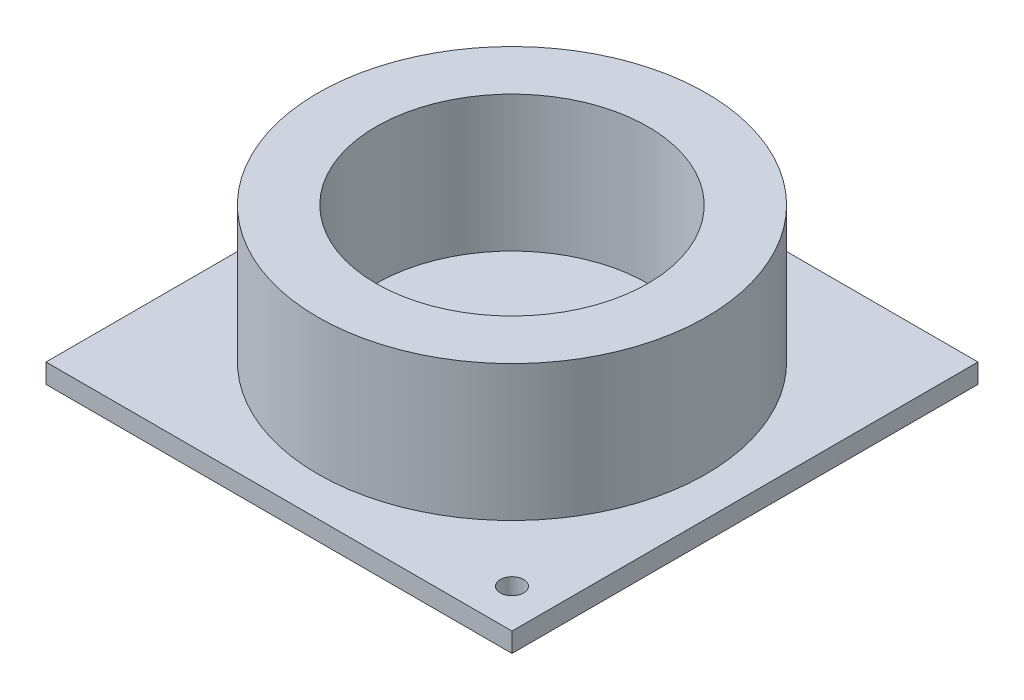
ISO-10303-21;
HEADER;
FILE_DESCRIPTION(('STEP AP214'),'2;1');
FILE_NAME('part.step','',(''),(''),'','','');
FILE_SCHEMA(('AUTOMOTIVE_DESIGN { 1 0 10303 214 1 1 1 1 }'));
ENDSEC;
DATA;
#1=APPLICATION_CONTEXT('core data for automotive mechanical design processes');
#2=APPLICATION_PROTOCOL_DEFINITION('international standard','automotive_design',2000,#1);
#3=PRODUCT_CONTEXT('',#1,'mechanical');
#4=PRODUCT('Part','Part','',(#3));
#5=PRODUCT_RELATED_PRODUCT_CATEGORY('part','',(#4));
#6=PRODUCT_DEFINITION_FORMATION('','',#4);
#7=PRODUCT_DEFINITION_CONTEXT('part definition',#1,'design');
#8=PRODUCT_DEFINITION('design','',#6,#7);
#9=PRODUCT_DEFINITION_SHAPE('','',#8);
#10=(LENGTH_UNIT() NAMED_UNIT(*) SI_UNIT(.MILLI.,.METRE.));
#11=(NAMED_UNIT(*) PLANE_ANGLE_UNIT() SI_UNIT($,.RADIAN.));
#12=(NAMED_UNIT(*) SI_UNIT($,.STERADIAN.) SOLID_ANGLE_UNIT());
#13=UNCERTAINTY_MEASURE_WITH_UNIT(LENGTH_MEASURE(1.E-05),#10,'distance_accuracy_value','');
#14=(GEOMETRIC_REPRESENTATION_CONTEXT(3) GLOBAL_UNCERTAINTY_ASSIGNED_CONTEXT((#13)) GLOBAL_UNIT_ASSIGNED_CONTEXT((#10,
#11,#12)) REPRESENTATION_CONTEXT('',''));
#15=CARTESIAN_POINT('',(0.,0.,0.));
#16=DIRECTION('',(0.,0.,1.));
#17=DIRECTION('',(1.,0.,0.));
#18=AXIS2_PLACEMENT_3D('',#15,#16,#17);
#19=CARTESIAN_POINT('',(0.,40.,0.));
#20=DIRECTION('',(0.,1.,0.));
#21=DIRECTION('',(0.,0.,1.));
#22=AXIS2_PLACEMENT_3D('',#19,#20,#21);
#23=PLANE('',#22);
#24=CARTESIAN_POINT('',(0.,40.,0.));
#25=DIRECTION('',(0.,1.,0.));
#26=DIRECTION('',(0.,0.,1.));
#27=AXIS2_PLACEMENT_3D('',#24,#25,#26);
#28=CIRCLE('',#27,50.);
#29=CARTESIAN_POINT('',(0.,40.,50.));
#30=VERTEX_POINT('',#29);
#31=EDGE_CURVE('E49',#30,#30,#28,.T.);
#32=ORIENTED_EDGE('',*,*,#31,.T.);
#33=EDGE_LOOP('',(#32));
#34=FACE_BOUND('',#33,.T.);
#35=CARTESIAN_POINT('',(0.,40.,0.));
#36=DIRECTION('',(0.,1.,0.));
#37=DIRECTION('',(0.,0.,1.));
#38=AXIS2_PLACEMENT_3D('',#35,#36,#37);
#39=CIRCLE('',#38,35.);
#40=CARTESIAN_POINT('',(0.,40.,35.));
#41=VERTEX_POINT('',#40);
#42=EDGE_CURVE('E133',#41,#41,#39,.T.);
#43=ORIENTED_EDGE('',*,*,#42,.F.);
#44=EDGE_LOOP('',(#43));
#45=FACE_BOUND('',#44,.T.);
#46=ADVANCED_FACE('F39',(#34,#45),#23,.T.);
#47=CARTESIAN_POINT('',(0.,40.,0.));
#48=DIRECTION('',(0.,-1.,0.));
#49=DIRECTION('',(0.,0.,-1.));
#50=AXIS2_PLACEMENT_3D('',#47,#48,#49);
#51=CYLINDRICAL_SURFACE('',#50,50.);
#52=CARTESIAN_POINT('',(0.,5.,0.));
#53=DIRECTION('',(0.,1.,0.));
#54=DIRECTION('',(0.,0.,1.));
#55=AXIS2_PLACEMENT_3D('',#52,#53,#54);
#56=CIRCLE('',#55,50.);
#57=CARTESIAN_POINT('',(0.,5.,50.));
#58=VERTEX_POINT('',#57);
#59=EDGE_CURVE('E129',#58,#58,#56,.T.);
#60=ORIENTED_EDGE('',*,*,#59,.T.);
#61=EDGE_LOOP('',(#60));
#62=FACE_BOUND('',#61,.T.);
#63=ORIENTED_EDGE('',*,*,#31,.F.);
#64=EDGE_LOOP('',(#63));
#65=FACE_BOUND('',#64,.T.);
#66=ADVANCED_FACE('F41',(#62,#65),#51,.T.);
#67=CARTESIAN_POINT('',(0.,40.,0.));
#68=DIRECTION('',(0.,-1.,0.));
#69=DIRECTION('',(0.,0.,-1.));
#70=AXIS2_PLACEMENT_3D('',#67,#68,#69);
#71=CYLINDRICAL_SURFACE('',#70,35.);
#72=CARTESIAN_POINT('',(0.,5.,0.));
#73=DIRECTION('',(0.,1.,0.));
#74=DIRECTION('',(0.,0.,1.));
#75=AXIS2_PLACEMENT_3D('',#72,#73,#74);
#76=CIRCLE('',#75,35.);
#77=CARTESIAN_POINT('',(0.,5.,35.));
#78=VERTEX_POINT('',#77);
#79=EDGE_CURVE('E11',#78,#78,#76,.T.);
#80=ORIENTED_EDGE('',*,*,#79,.F.);
#81=EDGE_LOOP('',(#80));
#82=FACE_BOUND('',#81,.T.);
#83=ORIENTED_EDGE('',*,*,#42,.T.);
#84=EDGE_LOOP('',(#83));
#85=FACE_BOUND('',#84,.T.);
#86=ADVANCED_FACE('F143',(#82,#85),#71,.F.);
#87=CARTESIAN_POINT('',(0.,5.,0.));
#88=DIRECTION('',(0.,1.,0.));
#89=DIRECTION('',(0.,0.,1.));
#90=AXIS2_PLACEMENT_3D('',#87,#88,#89);
#91=PLANE('',#90);
#92=ORIENTED_EDGE('',*,*,#79,.T.);
#93=EDGE_LOOP('',(#92));
#94=FACE_BOUND('',#93,.T.);
#95=ADVANCED_FACE('F149',(#94),#91,.T.);
#96=CARTESIAN_POINT('',(60.,5.,-60.));
#97=DIRECTION('',(-1.,0.,0.));
#98=DIRECTION('',(0.,0.,1.));
#99=AXIS2_PLACEMENT_3D('',#96,#97,#98);
#100=PLANE('',#99);
#101=DIRECTION('',(0.,0.,-1.));
#102=VECTOR('',#101,1.);
#103=CARTESIAN_POINT('',(60.,0.,-60.));
#104=LINE('',#103,#102);
#105=CARTESIAN_POINT('',(60.,0.,60.));
#106=VERTEX_POINT('',#105);
#107=CARTESIAN_POINT('',(60.,0.,-60.));
#108=VERTEX_POINT('',#107);
#109=EDGE_CURVE('E112',#106,#108,#104,.T.);
#110=ORIENTED_EDGE('',*,*,#109,.T.);
#111=DIRECTION('',(0.,-1.,0.));
#112=VECTOR('',#111,1.);
#113=CARTESIAN_POINT('',(60.,5.,-60.));
#114=LINE('',#113,#112);
#115=CARTESIAN_POINT('',(60.,5.,-60.));
#116=VERTEX_POINT('',#115);
#117=EDGE_CURVE('E101',#116,#108,#114,.T.);
#118=ORIENTED_EDGE('',*,*,#117,.F.);
#119=DIRECTION('',(0.,0.,-1.));
#120=VECTOR('',#119,1.);
#121=CARTESIAN_POINT('',(60.,5.,-60.));
#122=LINE('',#121,#120);
#123=CARTESIAN_POINT('',(60.,5.,60.));
#124=VERTEX_POINT('',#123);
#125=EDGE_CURVE('E93',#124,#116,#122,.T.);
#126=ORIENTED_EDGE('',*,*,#125,.F.);
#127=DIRECTION('',(0.,-1.,0.));
#128=VECTOR('',#127,1.);
#129=CARTESIAN_POINT('',(60.,5.,60.));
#130=LINE('',#129,#128);
#131=EDGE_CURVE('E108',#124,#106,#130,.T.);
#132=ORIENTED_EDGE('',*,*,#131,.T.);
#133=EDGE_LOOP('',(#110,#118,#126,#132));
#134=FACE_BOUND('',#133,.T.);
#135=ADVANCED_FACE('F171',(#134),#100,.F.);
#136=CARTESIAN_POINT('',(-60.,5.,-60.));
#137=DIRECTION('',(0.,0.,1.));
#138=DIRECTION('',(1.,0.,0.));
#139=AXIS2_PLACEMENT_3D('',#136,#137,#138);
#140=PLANE('',#139);
#141=DIRECTION('',(-1.,0.,0.));
#142=VECTOR('',#141,1.);
#143=CARTESIAN_POINT('',(-60.,0.,-60.));
#144=LINE('',#143,#142);
#145=CARTESIAN_POINT('',(-60.,0.,-60.));
#146=VERTEX_POINT('',#145);
#147=EDGE_CURVE('E99',#108,#146,#144,.T.);
#148=ORIENTED_EDGE('',*,*,#147,.T.);
#149=DIRECTION('',(0.,-1.,0.));
#150=VECTOR('',#149,1.);
#151=CARTESIAN_POINT('',(-60.,5.,-60.));
#152=LINE('',#151,#150);
#153=CARTESIAN_POINT('',(-60.,5.,-60.));
#154=VERTEX_POINT('',#153);
#155=EDGE_CURVE('E97',#154,#146,#152,.T.);
#156=ORIENTED_EDGE('',*,*,#155,.F.);
#157=DIRECTION('',(-1.,0.,0.));
#158=VECTOR('',#157,1.);
#159=CARTESIAN_POINT('',(-60.,5.,-60.));
#160=LINE('',#159,#158);
#161=EDGE_CURVE('E88',#116,#154,#160,.T.);
#162=ORIENTED_EDGE('',*,*,#161,.F.);
#163=ORIENTED_EDGE('',*,*,#117,.T.);
#164=EDGE_LOOP('',(#148,#156,#162,#163));
#165=FACE_BOUND('',#164,.T.);
#166=ADVANCED_FACE('F98',(#165),#140,.F.);
#167=CARTESIAN_POINT('',(-60.,5.,-60.));
#168=DIRECTION('',(1.,0.,0.));
#169=DIRECTION('',(0.,0.,-1.));
#170=AXIS2_PLACEMENT_3D('',#167,#168,#169);
#171=PLANE('',#170);
#172=DIRECTION('',(0.,0.,1.));
#173=VECTOR('',#172,1.);
#174=CARTESIAN_POINT('',(-60.,0.,-60.));
#175=LINE('',#174,#173);
#176=CARTESIAN_POINT('',(-60.,0.,60.));
#177=VERTEX_POINT('',#176);
#178=EDGE_CURVE('E74',#146,#177,#175,.T.);
#179=ORIENTED_EDGE('',*,*,#178,.T.);
#180=DIRECTION('',(0.,-1.,0.));
#181=VECTOR('',#180,1.);
#182=CARTESIAN_POINT('',(-60.,5.,60.));
#183=LINE('',#182,#181);
#184=CARTESIAN_POINT('',(-60.,5.,60.));
#185=VERTEX_POINT('',#184);
#186=EDGE_CURVE('E102',#185,#177,#183,.T.);
#187=ORIENTED_EDGE('',*,*,#186,.F.);
#188=DIRECTION('',(0.,0.,1.));
#189=VECTOR('',#188,1.);
#190=CARTESIAN_POINT('',(-60.,5.,-60.));
#191=LINE('',#190,#189);
#192=EDGE_CURVE('E91',#154,#185,#191,.T.);
#193=ORIENTED_EDGE('',*,*,#192,.F.);
#194=ORIENTED_EDGE('',*,*,#155,.T.);
#195=EDGE_LOOP('',(#179,#187,#193,#194));
#196=FACE_BOUND('',#195,.T.);
#197=ADVANCED_FACE('F104',(#196),#171,.F.);
#198=CARTESIAN_POINT('',(-60.,5.,60.));
#199=DIRECTION('',(0.,0.,-1.));
#200=DIRECTION('',(-1.,0.,0.));
#201=AXIS2_PLACEMENT_3D('',#198,#199,#200);
#202=PLANE('',#201);
#203=DIRECTION('',(1.,0.,0.));
#204=VECTOR('',#203,1.);
#205=CARTESIAN_POINT('',(-60.,0.,60.));
#206=LINE('',#205,#204);
#207=EDGE_CURVE('E80',#177,#106,#206,.T.);
#208=ORIENTED_EDGE('',*,*,#207,.T.);
#209=ORIENTED_EDGE('',*,*,#131,.F.);
#210=DIRECTION('',(1.,0.,0.));
#211=VECTOR('',#210,1.);
#212=CARTESIAN_POINT('',(-60.,5.,60.));
#213=LINE('',#212,#211);
#214=EDGE_CURVE('E57',#185,#124,#213,.T.);
#215=ORIENTED_EDGE('',*,*,#214,.F.);
#216=ORIENTED_EDGE('',*,*,#186,.T.);
#217=EDGE_LOOP('',(#208,#209,#215,#216));
#218=FACE_BOUND('',#217,.T.);
#219=ADVANCED_FACE('F157',(#218),#202,.F.);
#220=CARTESIAN_POINT('',(-50.,5.,-50.));
#221=DIRECTION('',(0.,1.,0.));
#222=DIRECTION('',(0.,0.,1.));
#223=AXIS2_PLACEMENT_3D('',#220,#221,#222);
#224=CIRCLE('',#223,3.);
#225=CARTESIAN_POINT('',(-50.,5.,-47.));
#226=VERTEX_POINT('',#225);
#227=EDGE_CURVE('E232',#226,#226,#224,.T.);
#228=ORIENTED_EDGE('',*,*,#227,.F.);
#229=EDGE_LOOP('',(#228));
#230=FACE_BOUND('',#229,.T.);
#231=CARTESIAN_POINT('',(50.,5.,50.));
#232=DIRECTION('',(0.,1.,0.));
#233=DIRECTION('',(0.,0.,1.));
#234=AXIS2_PLACEMENT_3D('',#231,#232,#233);
#235=CIRCLE('',#234,3.);
#236=CARTESIAN_POINT('',(50.,5.,53.));
#237=VERTEX_POINT('',#236);
#238=EDGE_CURVE('E240',#237,#237,#235,.T.);
#239=ORIENTED_EDGE('',*,*,#238,.F.);
#240=EDGE_LOOP('',(#239));
#241=FACE_BOUND('',#240,.T.);
#242=ORIENTED_EDGE('',*,*,#59,.F.);
#243=EDGE_LOOP('',(#242));
#244=FACE_BOUND('',#243,.T.);
#245=ORIENTED_EDGE('',*,*,#125,.T.);
#246=ORIENTED_EDGE('',*,*,#161,.T.);
#247=ORIENTED_EDGE('',*,*,#192,.T.);
#248=ORIENTED_EDGE('',*,*,#214,.T.);
#249=EDGE_LOOP('',(#245,#246,#247,#248));
#250=FACE_BOUND('',#249,.T.);
#251=ADVANCED_FACE('F89',(#230,#241,#244,#250),#91,.T.);
#252=CARTESIAN_POINT('',(0.,0.,0.));
#253=DIRECTION('',(0.,1.,0.));
#254=DIRECTION('',(0.,0.,1.));
#255=AXIS2_PLACEMENT_3D('',#252,#253,#254);
#256=PLANE('',#255);
#257=CARTESIAN_POINT('',(-50.,0.,-50.));
#258=DIRECTION('',(0.,1.,0.));
#259=DIRECTION('',(0.,0.,1.));
#260=AXIS2_PLACEMENT_3D('',#257,#258,#259);
#261=CIRCLE('',#260,3.);
#262=CARTESIAN_POINT('',(-50.,0.,-47.));
#263=VERTEX_POINT('',#262);
#264=EDGE_CURVE('E116',#263,#263,#261,.T.);
#265=ORIENTED_EDGE('',*,*,#264,.T.);
#266=EDGE_LOOP('',(#265));
#267=FACE_BOUND('',#266,.T.);
#268=CARTESIAN_POINT('',(50.,0.,50.));
#269=DIRECTION('',(0.,1.,0.));
#270=DIRECTION('',(0.,0.,1.));
#271=AXIS2_PLACEMENT_3D('',#268,#269,#270);
#272=CIRCLE('',#271,3.);
#273=CARTESIAN_POINT('',(50.,0.,53.));
#274=VERTEX_POINT('',#273);
#275=EDGE_CURVE('E234',#274,#274,#272,.T.);
#276=ORIENTED_EDGE('',*,*,#275,.T.);
#277=EDGE_LOOP('',(#276));
#278=FACE_BOUND('',#277,.T.);
#279=ORIENTED_EDGE('',*,*,#109,.F.);
#280=ORIENTED_EDGE('',*,*,#207,.F.);
#281=ORIENTED_EDGE('',*,*,#178,.F.);
#282=ORIENTED_EDGE('',*,*,#147,.F.);
#283=EDGE_LOOP('',(#279,#280,#281,#282));
#284=FACE_BOUND('',#283,.T.);
#285=ADVANCED_FACE('F156',(#267,#278,#284),#256,.F.);
#286=CARTESIAN_POINT('',(50.,0.,50.));
#287=DIRECTION('',(0.,1.,0.));
#288=DIRECTION('',(0.,0.,1.));
#289=AXIS2_PLACEMENT_3D('',#286,#287,#288);
#290=CYLINDRICAL_SURFACE('',#289,3.);
#291=ORIENTED_EDGE('',*,*,#275,.F.);
#292=EDGE_LOOP('',(#291));
#293=FACE_BOUND('',#292,.T.);
#294=ORIENTED_EDGE('',*,*,#238,.T.);
#295=EDGE_LOOP('',(#294));
#296=FACE_BOUND('',#295,.T.);
#297=ADVANCED_FACE('F164',(#293,#296),#290,.F.);
#298=CARTESIAN_POINT('',(-50.,0.,-50.));
#299=DIRECTION('',(0.,1.,0.));
#300=DIRECTION('',(0.,0.,1.));
#301=AXIS2_PLACEMENT_3D('',#298,#299,#300);
#302=CYLINDRICAL_SURFACE('',#301,3.);
#303=ORIENTED_EDGE('',*,*,#264,.F.);
#304=EDGE_LOOP('',(#303));
#305=FACE_BOUND('',#304,.T.);
#306=ORIENTED_EDGE('',*,*,#227,.T.);
#307=EDGE_LOOP('',(#306));
#308=FACE_BOUND('',#307,.T.);
#309=ADVANCED_FACE('F215',(#305,#308),#302,.F.);
#310=CLOSED_SHELL('',(#46,#66,#86,#95,#135,#166,#197,#219,#251,#285,#297,#309));
#311=MANIFOLD_SOLID_BREP('B2',#310);
#312=ADVANCED_BREP_SHAPE_REPRESENTATION('',(#18,#311),#14);
#313=SHAPE_DEFINITION_REPRESENTATION(#9,#312);
ENDSEC;
END-ISO-10303-21;
